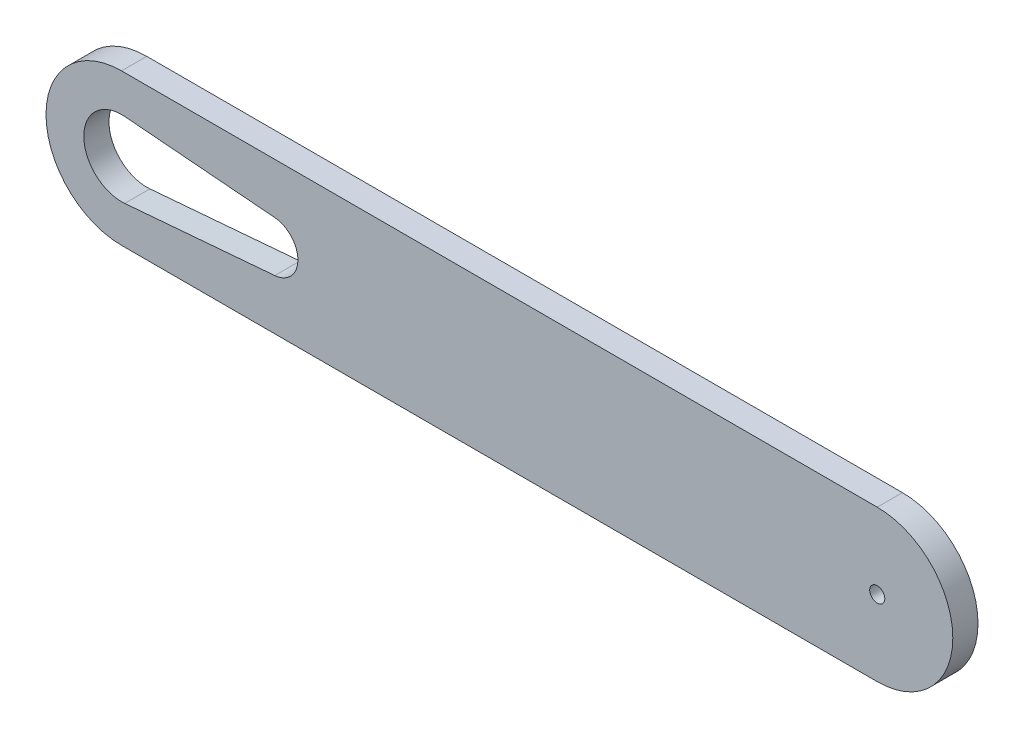
ISO-10303-21;
HEADER;
FILE_DESCRIPTION(('STEP AP214'),'2;1');
FILE_NAME('part.step','',(''),(''),'','','');
FILE_SCHEMA(('AUTOMOTIVE_DESIGN { 1 0 10303 214 1 1 1 1 }'));
ENDSEC;
DATA;
#1=APPLICATION_CONTEXT('core data for automotive mechanical design processes');
#2=APPLICATION_PROTOCOL_DEFINITION('international standard','automotive_design',2000,#1);
#3=PRODUCT_CONTEXT('',#1,'mechanical');
#4=PRODUCT('Part','Part','',(#3));
#5=PRODUCT_RELATED_PRODUCT_CATEGORY('part','',(#4));
#6=PRODUCT_DEFINITION_FORMATION('','',#4);
#7=PRODUCT_DEFINITION_CONTEXT('part definition',#1,'design');
#8=PRODUCT_DEFINITION('design','',#6,#7);
#9=PRODUCT_DEFINITION_SHAPE('','',#8);
#10=(LENGTH_UNIT() NAMED_UNIT(*) SI_UNIT(.MILLI.,.METRE.));
#11=(NAMED_UNIT(*) PLANE_ANGLE_UNIT() SI_UNIT($,.RADIAN.));
#12=(NAMED_UNIT(*) SI_UNIT($,.STERADIAN.) SOLID_ANGLE_UNIT());
#13=UNCERTAINTY_MEASURE_WITH_UNIT(LENGTH_MEASURE(1.E-05),#10,'distance_accuracy_value','');
#14=(GEOMETRIC_REPRESENTATION_CONTEXT(3) GLOBAL_UNCERTAINTY_ASSIGNED_CONTEXT((#13)) GLOBAL_UNIT_ASSIGNED_CONTEXT((#10,
#11,#12)) REPRESENTATION_CONTEXT('',''));
#15=CARTESIAN_POINT('',(0.,0.,0.));
#16=DIRECTION('',(0.,0.,1.));
#17=DIRECTION('',(1.,0.,0.));
#18=AXIS2_PLACEMENT_3D('',#15,#16,#17);
#19=CARTESIAN_POINT('',(-75.,0.,5.));
#20=DIRECTION('',(0.,0.,-1.));
#21=DIRECTION('',(-1.,0.,0.));
#22=AXIS2_PLACEMENT_3D('',#19,#20,#21);
#23=CYLINDRICAL_SURFACE('',#22,15.);
#24=CARTESIAN_POINT('',(-75.,0.,0.));
#25=DIRECTION('',(0.,0.,1.));
#26=DIRECTION('',(1.,0.,0.));
#27=AXIS2_PLACEMENT_3D('',#24,#25,#26);
#28=CIRCLE('',#27,15.);
#29=CARTESIAN_POINT('',(-75.,15.,0.));
#30=VERTEX_POINT('',#29);
#31=CARTESIAN_POINT('',(-75.,-15.,0.));
#32=VERTEX_POINT('',#31);
#33=EDGE_CURVE('E170',#30,#32,#28,.T.);
#34=ORIENTED_EDGE('',*,*,#33,.T.);
#35=DIRECTION('',(0.,0.,-1.));
#36=VECTOR('',#35,1.);
#37=CARTESIAN_POINT('',(-75.,-15.,5.));
#38=LINE('',#37,#36);
#39=CARTESIAN_POINT('',(-75.,-15.,5.));
#40=VERTEX_POINT('',#39);
#41=EDGE_CURVE('E11',#40,#32,#38,.T.);
#42=ORIENTED_EDGE('',*,*,#41,.F.);
#43=CARTESIAN_POINT('',(-75.,0.,5.));
#44=DIRECTION('',(0.,0.,1.));
#45=DIRECTION('',(1.,0.,0.));
#46=AXIS2_PLACEMENT_3D('',#43,#44,#45);
#47=CIRCLE('',#46,15.);
#48=CARTESIAN_POINT('',(-75.,15.,5.));
#49=VERTEX_POINT('',#48);
#50=EDGE_CURVE('E155',#49,#40,#47,.T.);
#51=ORIENTED_EDGE('',*,*,#50,.F.);
#52=DIRECTION('',(0.,0.,-1.));
#53=VECTOR('',#52,1.);
#54=CARTESIAN_POINT('',(-75.,15.,5.));
#55=LINE('',#54,#53);
#56=EDGE_CURVE('E169',#49,#30,#55,.T.);
#57=ORIENTED_EDGE('',*,*,#56,.T.);
#58=EDGE_LOOP('',(#34,#42,#51,#57));
#59=FACE_BOUND('',#58,.T.);
#60=ADVANCED_FACE('F39',(#59),#23,.T.);
#61=CARTESIAN_POINT('',(-75.,-15.,5.));
#62=DIRECTION('',(0.,1.,0.));
#63=DIRECTION('',(0.,0.,1.));
#64=AXIS2_PLACEMENT_3D('',#61,#62,#63);
#65=PLANE('',#64);
#66=DIRECTION('',(1.,0.,0.));
#67=VECTOR('',#66,1.);
#68=CARTESIAN_POINT('',(-75.,-15.,0.));
#69=LINE('',#68,#67);
#70=CARTESIAN_POINT('',(75.,-15.,0.));
#71=VERTEX_POINT('',#70);
#72=EDGE_CURVE('E174',#32,#71,#69,.T.);
#73=ORIENTED_EDGE('',*,*,#72,.T.);
#74=DIRECTION('',(0.,0.,-1.));
#75=VECTOR('',#74,1.);
#76=CARTESIAN_POINT('',(75.,-15.,5.));
#77=LINE('',#76,#75);
#78=CARTESIAN_POINT('',(75.,-15.,5.));
#79=VERTEX_POINT('',#78);
#80=EDGE_CURVE('E47',#79,#71,#77,.T.);
#81=ORIENTED_EDGE('',*,*,#80,.F.);
#82=DIRECTION('',(1.,0.,0.));
#83=VECTOR('',#82,1.);
#84=CARTESIAN_POINT('',(-75.,-15.,5.));
#85=LINE('',#84,#83);
#86=EDGE_CURVE('E159',#40,#79,#85,.T.);
#87=ORIENTED_EDGE('',*,*,#86,.F.);
#88=ORIENTED_EDGE('',*,*,#41,.T.);
#89=EDGE_LOOP('',(#73,#81,#87,#88));
#90=FACE_BOUND('',#89,.T.);
#91=ADVANCED_FACE('F209',(#90),#65,.F.);
#92=CARTESIAN_POINT('',(75.,0.,5.));
#93=DIRECTION('',(0.,0.,-1.));
#94=DIRECTION('',(-1.,0.,0.));
#95=AXIS2_PLACEMENT_3D('',#92,#93,#94);
#96=CYLINDRICAL_SURFACE('',#95,15.);
#97=CARTESIAN_POINT('',(75.,0.,0.));
#98=DIRECTION('',(0.,0.,1.));
#99=DIRECTION('',(1.,0.,0.));
#100=AXIS2_PLACEMENT_3D('',#97,#98,#99);
#101=CIRCLE('',#100,15.);
#102=CARTESIAN_POINT('',(75.,15.,0.));
#103=VERTEX_POINT('',#102);
#104=EDGE_CURVE('E178',#71,#103,#101,.T.);
#105=ORIENTED_EDGE('',*,*,#104,.T.);
#106=DIRECTION('',(0.,0.,-1.));
#107=VECTOR('',#106,1.);
#108=CARTESIAN_POINT('',(75.,15.,5.));
#109=LINE('',#108,#107);
#110=CARTESIAN_POINT('',(75.,15.,5.));
#111=VERTEX_POINT('',#110);
#112=EDGE_CURVE('E186',#111,#103,#109,.T.);
#113=ORIENTED_EDGE('',*,*,#112,.F.);
#114=CARTESIAN_POINT('',(75.,0.,5.));
#115=DIRECTION('',(0.,0.,1.));
#116=DIRECTION('',(1.,0.,0.));
#117=AXIS2_PLACEMENT_3D('',#114,#115,#116);
#118=CIRCLE('',#117,15.);
#119=EDGE_CURVE('E163',#79,#111,#118,.T.);
#120=ORIENTED_EDGE('',*,*,#119,.F.);
#121=ORIENTED_EDGE('',*,*,#80,.T.);
#122=EDGE_LOOP('',(#105,#113,#120,#121));
#123=FACE_BOUND('',#122,.T.);
#124=ADVANCED_FACE('F195',(#123),#96,.T.);
#125=CARTESIAN_POINT('',(-75.,15.,5.));
#126=DIRECTION('',(0.,-1.,0.));
#127=DIRECTION('',(0.,0.,-1.));
#128=AXIS2_PLACEMENT_3D('',#125,#126,#127);
#129=PLANE('',#128);
#130=DIRECTION('',(-1.,0.,0.));
#131=VECTOR('',#130,1.);
#132=CARTESIAN_POINT('',(-75.,15.,0.));
#133=LINE('',#132,#131);
#134=EDGE_CURVE('E160',#103,#30,#133,.T.);
#135=ORIENTED_EDGE('',*,*,#134,.T.);
#136=ORIENTED_EDGE('',*,*,#56,.F.);
#137=DIRECTION('',(-1.,0.,0.));
#138=VECTOR('',#137,1.);
#139=CARTESIAN_POINT('',(-75.,15.,5.));
#140=LINE('',#139,#138);
#141=EDGE_CURVE('E166',#111,#49,#140,.T.);
#142=ORIENTED_EDGE('',*,*,#141,.F.);
#143=ORIENTED_EDGE('',*,*,#112,.T.);
#144=EDGE_LOOP('',(#135,#136,#142,#143));
#145=FACE_BOUND('',#144,.T.);
#146=ADVANCED_FACE('F204',(#145),#129,.F.);
#147=CARTESIAN_POINT('',(-75.,0.,5.));
#148=DIRECTION('',(0.,0.,1.));
#149=DIRECTION('',(1.,0.,0.));
#150=AXIS2_PLACEMENT_3D('',#147,#148,#149);
#151=PLANE('',#150);
#152=CARTESIAN_POINT('',(75.,0.,5.));
#153=DIRECTION('',(0.,0.,-1.));
#154=DIRECTION('',(-1.,0.,0.));
#155=AXIS2_PLACEMENT_3D('',#152,#153,#154);
#156=CIRCLE('',#155,1.5);
#157=CARTESIAN_POINT('',(73.5,0.,5.));
#158=VERTEX_POINT('',#157);
#159=EDGE_CURVE('E175',#158,#158,#156,.T.);
#160=ORIENTED_EDGE('',*,*,#159,.T.);
#161=EDGE_LOOP('',(#160));
#162=FACE_BOUND('',#161,.T.);
#163=CARTESIAN_POINT('',(-45.,0.,5.));
#164=DIRECTION('',(0.,0.,-1.));
#165=DIRECTION('',(-1.,0.,0.));
#166=AXIS2_PLACEMENT_3D('',#163,#164,#165);
#167=CIRCLE('',#166,5.);
#168=CARTESIAN_POINT('',(-44.5833333333333,4.98260864295891,5.));
#169=VERTEX_POINT('',#168);
#170=CARTESIAN_POINT('',(-44.5833333333333,-4.98260864295891,5.));
#171=VERTEX_POINT('',#170);
#172=EDGE_CURVE('E106',#169,#171,#167,.T.);
#173=ORIENTED_EDGE('',*,*,#172,.T.);
#174=DIRECTION('',(-0.996521728591783,-0.0833333333333334,0.));
#175=VECTOR('',#174,1.);
#176=CARTESIAN_POINT('',(-44.5833333333333,-4.98260864295891,5.));
#177=LINE('',#176,#175);
#178=CARTESIAN_POINT('',(-74.375,-7.47391296443837,5.));
#179=VERTEX_POINT('',#178);
#180=EDGE_CURVE('E116',#171,#179,#177,.T.);
#181=ORIENTED_EDGE('',*,*,#180,.T.);
#182=CARTESIAN_POINT('',(-75.,0.,5.));
#183=DIRECTION('',(0.,0.,-1.));
#184=DIRECTION('',(-1.,0.,0.));
#185=AXIS2_PLACEMENT_3D('',#182,#183,#184);
#186=CIRCLE('',#185,7.5);
#187=CARTESIAN_POINT('',(-74.375,7.47391296443837,5.));
#188=VERTEX_POINT('',#187);
#189=EDGE_CURVE('E54',#179,#188,#186,.T.);
#190=ORIENTED_EDGE('',*,*,#189,.T.);
#191=DIRECTION('',(0.996521728591783,-0.0833333333333333,0.));
#192=VECTOR('',#191,1.);
#193=CARTESIAN_POINT('',(-44.5833333333333,4.98260864295891,5.));
#194=LINE('',#193,#192);
#195=EDGE_CURVE('E113',#188,#169,#194,.T.);
#196=ORIENTED_EDGE('',*,*,#195,.T.);
#197=EDGE_LOOP('',(#173,#181,#190,#196));
#198=FACE_BOUND('',#197,.T.);
#199=ORIENTED_EDGE('',*,*,#50,.T.);
#200=ORIENTED_EDGE('',*,*,#86,.T.);
#201=ORIENTED_EDGE('',*,*,#119,.T.);
#202=ORIENTED_EDGE('',*,*,#141,.T.);
#203=EDGE_LOOP('',(#199,#200,#201,#202));
#204=FACE_BOUND('',#203,.T.);
#205=ADVANCED_FACE('F121',(#162,#198,#204),#151,.T.);
#206=CARTESIAN_POINT('',(-75.,0.,0.));
#207=DIRECTION('',(0.,0.,1.));
#208=DIRECTION('',(1.,0.,0.));
#209=AXIS2_PLACEMENT_3D('',#206,#207,#208);
#210=PLANE('',#209);
#211=CARTESIAN_POINT('',(75.,0.,0.));
#212=DIRECTION('',(0.,0.,-1.));
#213=DIRECTION('',(-1.,0.,0.));
#214=AXIS2_PLACEMENT_3D('',#211,#212,#213);
#215=CIRCLE('',#214,1.5);
#216=CARTESIAN_POINT('',(73.5,0.,0.));
#217=VERTEX_POINT('',#216);
#218=EDGE_CURVE('E132',#217,#217,#215,.T.);
#219=ORIENTED_EDGE('',*,*,#218,.F.);
#220=EDGE_LOOP('',(#219));
#221=FACE_BOUND('',#220,.T.);
#222=DIRECTION('',(-0.996521728591783,-0.0833333333333334,0.));
#223=VECTOR('',#222,1.);
#224=CARTESIAN_POINT('',(-44.5833333333333,-4.98260864295891,0.));
#225=LINE('',#224,#223);
#226=CARTESIAN_POINT('',(-44.5833333333333,-4.98260864295891,0.));
#227=VERTEX_POINT('',#226);
#228=CARTESIAN_POINT('',(-74.375,-7.47391296443837,0.));
#229=VERTEX_POINT('',#228);
#230=EDGE_CURVE('E141',#227,#229,#225,.T.);
#231=ORIENTED_EDGE('',*,*,#230,.F.);
#232=CARTESIAN_POINT('',(-45.,0.,0.));
#233=DIRECTION('',(0.,0.,-1.));
#234=DIRECTION('',(-1.,0.,0.));
#235=AXIS2_PLACEMENT_3D('',#232,#233,#234);
#236=CIRCLE('',#235,5.);
#237=CARTESIAN_POINT('',(-44.5833333333333,4.98260864295891,0.));
#238=VERTEX_POINT('',#237);
#239=EDGE_CURVE('E62',#238,#227,#236,.T.);
#240=ORIENTED_EDGE('',*,*,#239,.F.);
#241=DIRECTION('',(0.996521728591783,-0.0833333333333333,0.));
#242=VECTOR('',#241,1.);
#243=CARTESIAN_POINT('',(-44.5833333333333,4.98260864295891,0.));
#244=LINE('',#243,#242);
#245=CARTESIAN_POINT('',(-74.375,7.47391296443837,0.));
#246=VERTEX_POINT('',#245);
#247=EDGE_CURVE('E125',#246,#238,#244,.T.);
#248=ORIENTED_EDGE('',*,*,#247,.F.);
#249=CARTESIAN_POINT('',(-75.,0.,0.));
#250=DIRECTION('',(0.,0.,-1.));
#251=DIRECTION('',(-1.,0.,0.));
#252=AXIS2_PLACEMENT_3D('',#249,#250,#251);
#253=CIRCLE('',#252,7.5);
#254=EDGE_CURVE('E129',#229,#246,#253,.T.);
#255=ORIENTED_EDGE('',*,*,#254,.F.);
#256=EDGE_LOOP('',(#231,#240,#248,#255));
#257=FACE_BOUND('',#256,.T.);
#258=ORIENTED_EDGE('',*,*,#33,.F.);
#259=ORIENTED_EDGE('',*,*,#134,.F.);
#260=ORIENTED_EDGE('',*,*,#104,.F.);
#261=ORIENTED_EDGE('',*,*,#72,.F.);
#262=EDGE_LOOP('',(#258,#259,#260,#261));
#263=FACE_BOUND('',#262,.T.);
#264=ADVANCED_FACE('F201',(#221,#257,#263),#210,.F.);
#265=CARTESIAN_POINT('',(-45.,0.,5.));
#266=DIRECTION('',(0.,0.,-1.));
#267=DIRECTION('',(-1.,0.,0.));
#268=AXIS2_PLACEMENT_3D('',#265,#266,#267);
#269=CYLINDRICAL_SURFACE('',#268,5.);
#270=ORIENTED_EDGE('',*,*,#239,.T.);
#271=DIRECTION('',(0.,0.,-1.));
#272=VECTOR('',#271,1.);
#273=CARTESIAN_POINT('',(-44.5833333333333,-4.98260864295891,5.));
#274=LINE('',#273,#272);
#275=EDGE_CURVE('E102',#171,#227,#274,.T.);
#276=ORIENTED_EDGE('',*,*,#275,.F.);
#277=ORIENTED_EDGE('',*,*,#172,.F.);
#278=DIRECTION('',(0.,0.,-1.));
#279=VECTOR('',#278,1.);
#280=CARTESIAN_POINT('',(-44.5833333333333,4.98260864295891,5.));
#281=LINE('',#280,#279);
#282=EDGE_CURVE('E147',#169,#238,#281,.T.);
#283=ORIENTED_EDGE('',*,*,#282,.T.);
#284=EDGE_LOOP('',(#270,#276,#277,#283));
#285=FACE_BOUND('',#284,.T.);
#286=ADVANCED_FACE('F104',(#285),#269,.F.);
#287=CARTESIAN_POINT('',(-44.5833333333333,4.98260864295891,5.));
#288=DIRECTION('',(0.0833333333333333,0.996521728591783,0.));
#289=DIRECTION('',(-0.996521728591783,0.0833333333333332,0.));
#290=AXIS2_PLACEMENT_3D('',#287,#288,#289);
#291=PLANE('',#290);
#292=ORIENTED_EDGE('',*,*,#247,.T.);
#293=ORIENTED_EDGE('',*,*,#282,.F.);
#294=ORIENTED_EDGE('',*,*,#195,.F.);
#295=DIRECTION('',(0.,0.,-1.));
#296=VECTOR('',#295,1.);
#297=CARTESIAN_POINT('',(-74.375,7.47391296443837,5.));
#298=LINE('',#297,#296);
#299=EDGE_CURVE('E150',#188,#246,#298,.T.);
#300=ORIENTED_EDGE('',*,*,#299,.T.);
#301=EDGE_LOOP('',(#292,#293,#294,#300));
#302=FACE_BOUND('',#301,.T.);
#303=ADVANCED_FACE('F227',(#302),#291,.F.);
#304=CARTESIAN_POINT('',(-75.,0.,5.));
#305=DIRECTION('',(0.,0.,-1.));
#306=DIRECTION('',(-1.,0.,0.));
#307=AXIS2_PLACEMENT_3D('',#304,#305,#306);
#308=CYLINDRICAL_SURFACE('',#307,7.5);
#309=ORIENTED_EDGE('',*,*,#254,.T.);
#310=ORIENTED_EDGE('',*,*,#299,.F.);
#311=ORIENTED_EDGE('',*,*,#189,.F.);
#312=DIRECTION('',(0.,0.,-1.));
#313=VECTOR('',#312,1.);
#314=CARTESIAN_POINT('',(-74.375,-7.47391296443837,5.));
#315=LINE('',#314,#313);
#316=EDGE_CURVE('E112',#179,#229,#315,.T.);
#317=ORIENTED_EDGE('',*,*,#316,.T.);
#318=EDGE_LOOP('',(#309,#310,#311,#317));
#319=FACE_BOUND('',#318,.T.);
#320=ADVANCED_FACE('F231',(#319),#308,.F.);
#321=CARTESIAN_POINT('',(-44.5833333333333,-4.98260864295891,5.));
#322=DIRECTION('',(0.0833333333333334,-0.996521728591783,0.));
#323=DIRECTION('',(0.996521728591783,0.0833333333333334,0.));
#324=AXIS2_PLACEMENT_3D('',#321,#322,#323);
#325=PLANE('',#324);
#326=ORIENTED_EDGE('',*,*,#230,.T.);
#327=ORIENTED_EDGE('',*,*,#316,.F.);
#328=ORIENTED_EDGE('',*,*,#180,.F.);
#329=ORIENTED_EDGE('',*,*,#275,.T.);
#330=EDGE_LOOP('',(#326,#327,#328,#329));
#331=FACE_BOUND('',#330,.T.);
#332=ADVANCED_FACE('F117',(#331),#325,.F.);
#333=CARTESIAN_POINT('',(75.,0.,5.));
#334=DIRECTION('',(0.,0.,-1.));
#335=DIRECTION('',(-1.,0.,0.));
#336=AXIS2_PLACEMENT_3D('',#333,#334,#335);
#337=CYLINDRICAL_SURFACE('',#336,1.5);
#338=ORIENTED_EDGE('',*,*,#159,.F.);
#339=EDGE_LOOP('',(#338));
#340=FACE_BOUND('',#339,.T.);
#341=ORIENTED_EDGE('',*,*,#218,.T.);
#342=EDGE_LOOP('',(#341));
#343=FACE_BOUND('',#342,.T.);
#344=ADVANCED_FACE('F230',(#340,#343),#337,.F.);
#345=CLOSED_SHELL('',(#60,#91,#124,#146,#205,#264,#286,#303,#320,#332,#344));
#346=MANIFOLD_SOLID_BREP('B2',#345);
#347=ADVANCED_BREP_SHAPE_REPRESENTATION('',(#18,#346),#14);
#348=SHAPE_DEFINITION_REPRESENTATION(#9,#347);
ENDSEC;
END-ISO-10303-21;
